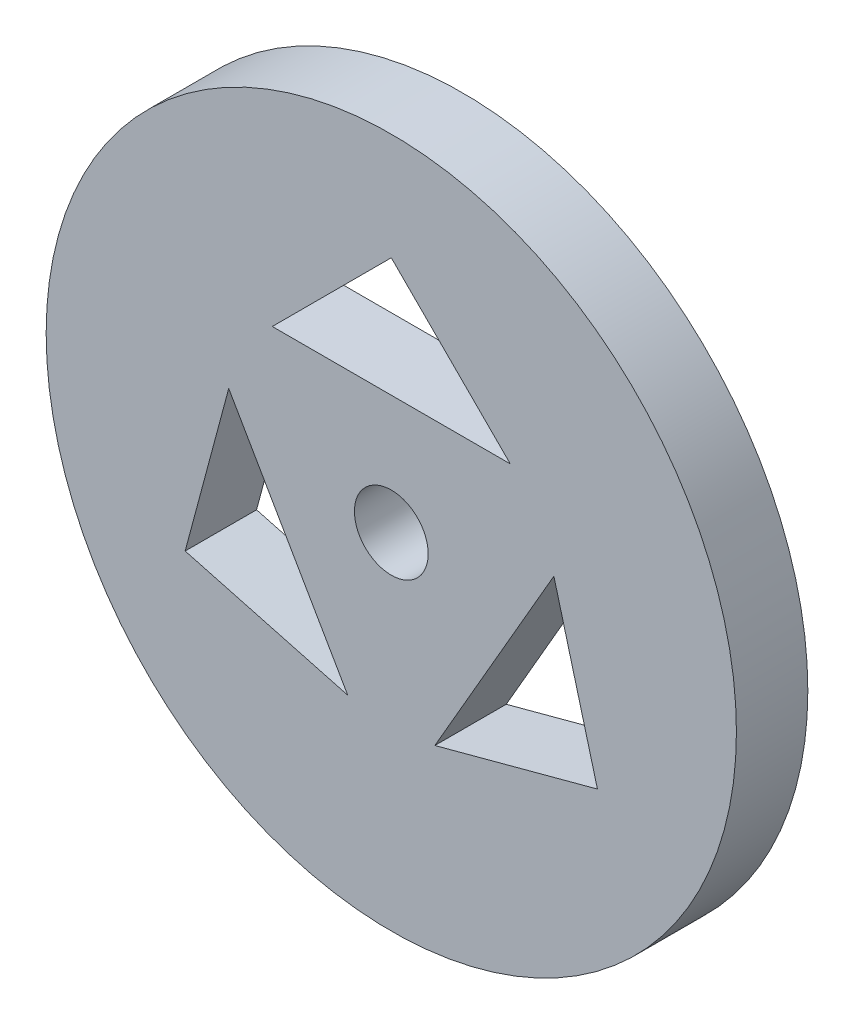
ISO-10303-21;
HEADER;
FILE_DESCRIPTION(('STEP AP214'),'2;1');
FILE_NAME('part.step','',(''),(''),'','','');
FILE_SCHEMA(('AUTOMOTIVE_DESIGN { 1 0 10303 214 1 1 1 1 }'));
ENDSEC;
DATA;
#1=APPLICATION_CONTEXT('core data for automotive mechanical design processes');
#2=APPLICATION_PROTOCOL_DEFINITION('international standard','automotive_design',2000,#1);
#3=PRODUCT_CONTEXT('',#1,'mechanical');
#4=PRODUCT('Part','Part','',(#3));
#5=PRODUCT_RELATED_PRODUCT_CATEGORY('part','',(#4));
#6=PRODUCT_DEFINITION_FORMATION('','',#4);
#7=PRODUCT_DEFINITION_CONTEXT('part definition',#1,'design');
#8=PRODUCT_DEFINITION('design','',#6,#7);
#9=PRODUCT_DEFINITION_SHAPE('','',#8);
#10=(LENGTH_UNIT() NAMED_UNIT(*) SI_UNIT(.MILLI.,.METRE.));
#11=(NAMED_UNIT(*) PLANE_ANGLE_UNIT() SI_UNIT($,.RADIAN.));
#12=(NAMED_UNIT(*) SI_UNIT($,.STERADIAN.) SOLID_ANGLE_UNIT());
#13=UNCERTAINTY_MEASURE_WITH_UNIT(LENGTH_MEASURE(1.E-05),#10,'distance_accuracy_value','');
#14=(GEOMETRIC_REPRESENTATION_CONTEXT(3) GLOBAL_UNCERTAINTY_ASSIGNED_CONTEXT((#13)) GLOBAL_UNIT_ASSIGNED_CONTEXT((#10,
#11,#12)) REPRESENTATION_CONTEXT('',''));
#15=CARTESIAN_POINT('',(0.,0.,0.));
#16=DIRECTION('',(0.,0.,1.));
#17=DIRECTION('',(1.,0.,0.));
#18=AXIS2_PLACEMENT_3D('',#15,#16,#17);
#19=CARTESIAN_POINT('',(0.,0.,6.));
#20=DIRECTION('',(0.,0.,-1.));
#21=DIRECTION('',(-1.,0.,0.));
#22=AXIS2_PLACEMENT_3D('',#19,#20,#21);
#23=CYLINDRICAL_SURFACE('',#22,29.);
#24=CARTESIAN_POINT('',(0.,0.,6.));
#25=DIRECTION('',(0.,0.,1.));
#26=DIRECTION('',(1.,0.,0.));
#27=AXIS2_PLACEMENT_3D('',#24,#25,#26);
#28=CIRCLE('',#27,29.);
#29=CARTESIAN_POINT('',(29.,0.,6.));
#30=VERTEX_POINT('',#29);
#31=EDGE_CURVE('E11',#30,#30,#28,.T.);
#32=ORIENTED_EDGE('',*,*,#31,.F.);
#33=EDGE_LOOP('',(#32));
#34=FACE_BOUND('',#33,.T.);
#35=CARTESIAN_POINT('',(0.,0.,0.));
#36=DIRECTION('',(0.,0.,1.));
#37=DIRECTION('',(1.,0.,0.));
#38=AXIS2_PLACEMENT_3D('',#35,#36,#37);
#39=CIRCLE('',#38,29.);
#40=CARTESIAN_POINT('',(29.,0.,0.));
#41=VERTEX_POINT('',#40);
#42=EDGE_CURVE('E40',#41,#41,#39,.T.);
#43=ORIENTED_EDGE('',*,*,#42,.T.);
#44=EDGE_LOOP('',(#43));
#45=FACE_BOUND('',#44,.T.);
#46=ADVANCED_FACE('F37',(#34,#45),#23,.T.);
#47=CARTESIAN_POINT('',(0.,0.,6.));
#48=DIRECTION('',(0.,0.,1.));
#49=DIRECTION('',(1.,0.,0.));
#50=AXIS2_PLACEMENT_3D('',#47,#48,#49);
#51=PLANE('',#50);
#52=DIRECTION('',(-0.707106781186548,0.707106781186547,0.));
#53=VECTOR('',#52,1.);
#54=CARTESIAN_POINT('',(0.,20.,6.));
#55=LINE('',#54,#53);
#56=CARTESIAN_POINT('',(10.,10.,6.));
#57=VERTEX_POINT('',#56);
#58=CARTESIAN_POINT('',(0.,20.,6.));
#59=VERTEX_POINT('',#58);
#60=EDGE_CURVE('E51',#57,#59,#55,.T.);
#61=ORIENTED_EDGE('',*,*,#60,.F.);
#62=DIRECTION('',(1.,0.,0.));
#63=VECTOR('',#62,1.);
#64=CARTESIAN_POINT('',(-10.,10.,6.));
#65=LINE('',#64,#63);
#66=CARTESIAN_POINT('',(-10.,10.,6.));
#67=VERTEX_POINT('',#66);
#68=EDGE_CURVE('E125',#67,#57,#65,.T.);
#69=ORIENTED_EDGE('',*,*,#68,.F.);
#70=DIRECTION('',(-0.707106781186548,-0.707106781186548,0.));
#71=VECTOR('',#70,1.);
#72=CARTESIAN_POINT('',(-10.,10.,6.));
#73=LINE('',#72,#71);
#74=EDGE_CURVE('E128',#59,#67,#73,.T.);
#75=ORIENTED_EDGE('',*,*,#74,.F.);
#76=EDGE_LOOP('',(#61,#69,#75));
#77=FACE_BOUND('',#76,.T.);
#78=DIRECTION('',(0.965925826289068,0.258819045102521,0.));
#79=VECTOR('',#78,1.);
#80=CARTESIAN_POINT('',(17.320508075689,-9.99999999999932,6.));
#81=LINE('',#80,#79);
#82=CARTESIAN_POINT('',(3.66025403784457,-13.6602540378437,6.));
#83=VERTEX_POINT('',#82);
#84=CARTESIAN_POINT('',(17.320508075689,-9.99999999999932,6.));
#85=VERTEX_POINT('',#84);
#86=EDGE_CURVE('E59',#83,#85,#81,.T.);
#87=ORIENTED_EDGE('',*,*,#86,.F.);
#88=DIRECTION('',(-0.5,-0.866025403784439,0.));
#89=VECTOR('',#88,1.);
#90=CARTESIAN_POINT('',(13.6602540378446,3.66025403784506,6.));
#91=LINE('',#90,#89);
#92=CARTESIAN_POINT('',(13.6602540378446,3.66025403784506,6.));
#93=VERTEX_POINT('',#92);
#94=EDGE_CURVE('E143',#93,#83,#91,.T.);
#95=ORIENTED_EDGE('',*,*,#94,.F.);
#96=DIRECTION('',(-0.258819045102521,0.965925826289068,0.));
#97=VECTOR('',#96,1.);
#98=CARTESIAN_POINT('',(13.6602540378446,3.66025403784506,6.));
#99=LINE('',#98,#97);
#100=EDGE_CURVE('E151',#85,#93,#99,.T.);
#101=ORIENTED_EDGE('',*,*,#100,.F.);
#102=EDGE_LOOP('',(#87,#95,#101));
#103=FACE_BOUND('',#102,.T.);
#104=DIRECTION('',(-0.25881904510252,-0.965925826289068,0.));
#105=VECTOR('',#104,1.);
#106=CARTESIAN_POINT('',(-17.3205080756881,-9.99999999999983,6.));
#107=LINE('',#106,#105);
#108=CARTESIAN_POINT('',(-13.6602540378437,3.66025403784456,6.));
#109=VERTEX_POINT('',#108);
#110=CARTESIAN_POINT('',(-17.3205080756881,-9.99999999999983,6.));
#111=VERTEX_POINT('',#110);
#112=EDGE_CURVE('E172',#109,#111,#107,.T.);
#113=ORIENTED_EDGE('',*,*,#112,.F.);
#114=DIRECTION('',(-0.5,0.866025403784438,0.));
#115=VECTOR('',#114,1.);
#116=CARTESIAN_POINT('',(-3.66025403784371,-13.6602540378442,6.));
#117=LINE('',#116,#115);
#118=CARTESIAN_POINT('',(-3.66025403784371,-13.6602540378442,6.));
#119=VERTEX_POINT('',#118);
#120=EDGE_CURVE('E165',#119,#109,#117,.T.);
#121=ORIENTED_EDGE('',*,*,#120,.F.);
#122=DIRECTION('',(0.965925826289068,-0.25881904510252,0.));
#123=VECTOR('',#122,1.);
#124=CARTESIAN_POINT('',(-3.66025403784371,-13.6602540378442,6.));
#125=LINE('',#124,#123);
#126=EDGE_CURVE('E174',#111,#119,#125,.T.);
#127=ORIENTED_EDGE('',*,*,#126,.F.);
#128=EDGE_LOOP('',(#113,#121,#127));
#129=FACE_BOUND('',#128,.T.);
#130=CARTESIAN_POINT('',(0.,0.,6.));
#131=DIRECTION('',(0.,0.,1.));
#132=DIRECTION('',(1.,0.,0.));
#133=AXIS2_PLACEMENT_3D('',#130,#131,#132);
#134=CIRCLE('',#133,3.1);
#135=CARTESIAN_POINT('',(3.1,0.,6.));
#136=VERTEX_POINT('',#135);
#137=EDGE_CURVE('E137',#136,#136,#134,.T.);
#138=ORIENTED_EDGE('',*,*,#137,.F.);
#139=EDGE_LOOP('',(#138));
#140=FACE_BOUND('',#139,.T.);
#141=ORIENTED_EDGE('',*,*,#31,.T.);
#142=EDGE_LOOP('',(#141));
#143=FACE_BOUND('',#142,.T.);
#144=ADVANCED_FACE('F192',(#77,#103,#129,#140,#143),#51,.T.);
#145=CARTESIAN_POINT('',(0.,0.,0.));
#146=DIRECTION('',(0.,0.,1.));
#147=DIRECTION('',(1.,0.,0.));
#148=AXIS2_PLACEMENT_3D('',#145,#146,#147);
#149=PLANE('',#148);
#150=DIRECTION('',(1.,0.,0.));
#151=VECTOR('',#150,1.);
#152=CARTESIAN_POINT('',(-10.,10.,0.));
#153=LINE('',#152,#151);
#154=CARTESIAN_POINT('',(-10.,10.,0.));
#155=VERTEX_POINT('',#154);
#156=CARTESIAN_POINT('',(10.,10.,0.));
#157=VERTEX_POINT('',#156);
#158=EDGE_CURVE('E115',#155,#157,#153,.T.);
#159=ORIENTED_EDGE('',*,*,#158,.T.);
#160=DIRECTION('',(-0.707106781186548,0.707106781186547,0.));
#161=VECTOR('',#160,1.);
#162=CARTESIAN_POINT('',(0.,20.,0.));
#163=LINE('',#162,#161);
#164=CARTESIAN_POINT('',(0.,20.,0.));
#165=VERTEX_POINT('',#164);
#166=EDGE_CURVE('E109',#157,#165,#163,.T.);
#167=ORIENTED_EDGE('',*,*,#166,.T.);
#168=DIRECTION('',(-0.707106781186548,-0.707106781186548,0.));
#169=VECTOR('',#168,1.);
#170=CARTESIAN_POINT('',(-10.,10.,0.));
#171=LINE('',#170,#169);
#172=EDGE_CURVE('E119',#165,#155,#171,.T.);
#173=ORIENTED_EDGE('',*,*,#172,.T.);
#174=EDGE_LOOP('',(#159,#167,#173));
#175=FACE_BOUND('',#174,.T.);
#176=DIRECTION('',(-0.5,-0.866025403784439,0.));
#177=VECTOR('',#176,1.);
#178=CARTESIAN_POINT('',(13.6602540378446,3.66025403784506,0.));
#179=LINE('',#178,#177);
#180=CARTESIAN_POINT('',(13.6602540378446,3.66025403784506,0.));
#181=VERTEX_POINT('',#180);
#182=CARTESIAN_POINT('',(3.66025403784457,-13.6602540378437,0.));
#183=VERTEX_POINT('',#182);
#184=EDGE_CURVE('E146',#181,#183,#179,.T.);
#185=ORIENTED_EDGE('',*,*,#184,.T.);
#186=DIRECTION('',(0.965925826289068,0.258819045102521,0.));
#187=VECTOR('',#186,1.);
#188=CARTESIAN_POINT('',(17.320508075689,-9.99999999999932,0.));
#189=LINE('',#188,#187);
#190=CARTESIAN_POINT('',(17.320508075689,-9.99999999999932,0.));
#191=VERTEX_POINT('',#190);
#192=EDGE_CURVE('E139',#183,#191,#189,.T.);
#193=ORIENTED_EDGE('',*,*,#192,.T.);
#194=DIRECTION('',(-0.258819045102521,0.965925826289068,0.));
#195=VECTOR('',#194,1.);
#196=CARTESIAN_POINT('',(13.6602540378446,3.66025403784506,0.));
#197=LINE('',#196,#195);
#198=EDGE_CURVE('E142',#191,#181,#197,.T.);
#199=ORIENTED_EDGE('',*,*,#198,.T.);
#200=EDGE_LOOP('',(#185,#193,#199));
#201=FACE_BOUND('',#200,.T.);
#202=DIRECTION('',(-0.5,0.866025403784438,0.));
#203=VECTOR('',#202,1.);
#204=CARTESIAN_POINT('',(-3.66025403784371,-13.6602540378442,0.));
#205=LINE('',#204,#203);
#206=CARTESIAN_POINT('',(-3.66025403784371,-13.6602540378442,0.));
#207=VERTEX_POINT('',#206);
#208=CARTESIAN_POINT('',(-13.6602540378437,3.66025403784456,0.));
#209=VERTEX_POINT('',#208);
#210=EDGE_CURVE('E168',#207,#209,#205,.T.);
#211=ORIENTED_EDGE('',*,*,#210,.T.);
#212=DIRECTION('',(-0.25881904510252,-0.965925826289068,0.));
#213=VECTOR('',#212,1.);
#214=CARTESIAN_POINT('',(-17.3205080756881,-9.99999999999983,0.));
#215=LINE('',#214,#213);
#216=CARTESIAN_POINT('',(-17.3205080756881,-9.99999999999983,0.));
#217=VERTEX_POINT('',#216);
#218=EDGE_CURVE('E161',#209,#217,#215,.T.);
#219=ORIENTED_EDGE('',*,*,#218,.T.);
#220=DIRECTION('',(0.965925826289068,-0.25881904510252,0.));
#221=VECTOR('',#220,1.);
#222=CARTESIAN_POINT('',(-3.66025403784371,-13.6602540378442,0.));
#223=LINE('',#222,#221);
#224=EDGE_CURVE('E164',#217,#207,#223,.T.);
#225=ORIENTED_EDGE('',*,*,#224,.T.);
#226=EDGE_LOOP('',(#211,#219,#225));
#227=FACE_BOUND('',#226,.T.);
#228=CARTESIAN_POINT('',(0.,0.,0.));
#229=DIRECTION('',(0.,0.,1.));
#230=DIRECTION('',(1.,0.,0.));
#231=AXIS2_PLACEMENT_3D('',#228,#229,#230);
#232=CIRCLE('',#231,3.1);
#233=CARTESIAN_POINT('',(3.1,0.,0.));
#234=VERTEX_POINT('',#233);
#235=EDGE_CURVE('E184',#234,#234,#232,.T.);
#236=ORIENTED_EDGE('',*,*,#235,.T.);
#237=EDGE_LOOP('',(#236));
#238=FACE_BOUND('',#237,.T.);
#239=ORIENTED_EDGE('',*,*,#42,.F.);
#240=EDGE_LOOP('',(#239));
#241=FACE_BOUND('',#240,.T.);
#242=ADVANCED_FACE('F123',(#175,#201,#227,#238,#241),#149,.F.);
#243=CARTESIAN_POINT('',(0.,0.,0.));
#244=DIRECTION('',(0.,0.,1.));
#245=DIRECTION('',(1.,0.,0.));
#246=AXIS2_PLACEMENT_3D('',#243,#244,#245);
#247=CYLINDRICAL_SURFACE('',#246,3.1);
#248=ORIENTED_EDGE('',*,*,#235,.F.);
#249=EDGE_LOOP('',(#248));
#250=FACE_BOUND('',#249,.T.);
#251=ORIENTED_EDGE('',*,*,#137,.T.);
#252=EDGE_LOOP('',(#251));
#253=FACE_BOUND('',#252,.T.);
#254=ADVANCED_FACE('F190',(#250,#253),#247,.F.);
#255=CARTESIAN_POINT('',(-17.3205080756881,-9.99999999999983,0.));
#256=DIRECTION('',(-0.965925826289069,0.25881904510252,0.));
#257=DIRECTION('',(-0.25881904510252,-0.965925826289069,0.));
#258=AXIS2_PLACEMENT_3D('',#255,#256,#257);
#259=PLANE('',#258);
#260=ORIENTED_EDGE('',*,*,#112,.T.);
#261=DIRECTION('',(0.,0.,1.));
#262=VECTOR('',#261,1.);
#263=CARTESIAN_POINT('',(-17.3205080756881,-9.99999999999983,0.));
#264=LINE('',#263,#262);
#265=EDGE_CURVE('E171',#217,#111,#264,.T.);
#266=ORIENTED_EDGE('',*,*,#265,.F.);
#267=ORIENTED_EDGE('',*,*,#218,.F.);
#268=DIRECTION('',(0.,0.,1.));
#269=VECTOR('',#268,1.);
#270=CARTESIAN_POINT('',(-13.6602540378437,3.66025403784456,0.));
#271=LINE('',#270,#269);
#272=EDGE_CURVE('E152',#209,#109,#271,.T.);
#273=ORIENTED_EDGE('',*,*,#272,.T.);
#274=EDGE_LOOP('',(#260,#266,#267,#273));
#275=FACE_BOUND('',#274,.T.);
#276=ADVANCED_FACE('F208',(#275),#259,.F.);
#277=CARTESIAN_POINT('',(-3.66025403784371,-13.6602540378442,0.));
#278=DIRECTION('',(0.866025403784438,0.5,0.));
#279=DIRECTION('',(-0.5,0.866025403784438,0.));
#280=AXIS2_PLACEMENT_3D('',#277,#278,#279);
#281=PLANE('',#280);
#282=ORIENTED_EDGE('',*,*,#120,.T.);
#283=ORIENTED_EDGE('',*,*,#272,.F.);
#284=ORIENTED_EDGE('',*,*,#210,.F.);
#285=DIRECTION('',(0.,0.,1.));
#286=VECTOR('',#285,1.);
#287=CARTESIAN_POINT('',(-3.66025403784371,-13.6602540378442,0.));
#288=LINE('',#287,#286);
#289=EDGE_CURVE('E180',#207,#119,#288,.T.);
#290=ORIENTED_EDGE('',*,*,#289,.T.);
#291=EDGE_LOOP('',(#282,#283,#284,#290));
#292=FACE_BOUND('',#291,.T.);
#293=ADVANCED_FACE('F214',(#292),#281,.F.);
#294=CARTESIAN_POINT('',(-3.66025403784371,-13.6602540378442,0.));
#295=DIRECTION('',(-0.25881904510252,-0.965925826289068,0.));
#296=DIRECTION('',(0.965925826289069,-0.25881904510252,0.));
#297=AXIS2_PLACEMENT_3D('',#294,#295,#296);
#298=PLANE('',#297);
#299=ORIENTED_EDGE('',*,*,#126,.T.);
#300=ORIENTED_EDGE('',*,*,#289,.F.);
#301=ORIENTED_EDGE('',*,*,#224,.F.);
#302=ORIENTED_EDGE('',*,*,#265,.T.);
#303=EDGE_LOOP('',(#299,#300,#301,#302));
#304=FACE_BOUND('',#303,.T.);
#305=ADVANCED_FACE('F216',(#304),#298,.F.);
#306=CARTESIAN_POINT('',(17.320508075689,-9.99999999999932,0.));
#307=DIRECTION('',(0.258819045102521,-0.965925826289068,0.));
#308=DIRECTION('',(0.965925826289068,0.258819045102521,0.));
#309=AXIS2_PLACEMENT_3D('',#306,#307,#308);
#310=PLANE('',#309);
#311=ORIENTED_EDGE('',*,*,#86,.T.);
#312=DIRECTION('',(0.,0.,1.));
#313=VECTOR('',#312,1.);
#314=CARTESIAN_POINT('',(17.320508075689,-9.99999999999932,0.));
#315=LINE('',#314,#313);
#316=EDGE_CURVE('E149',#191,#85,#315,.T.);
#317=ORIENTED_EDGE('',*,*,#316,.F.);
#318=ORIENTED_EDGE('',*,*,#192,.F.);
#319=DIRECTION('',(0.,0.,1.));
#320=VECTOR('',#319,1.);
#321=CARTESIAN_POINT('',(3.66025403784457,-13.6602540378437,0.));
#322=LINE('',#321,#320);
#323=EDGE_CURVE('E133',#183,#83,#322,.T.);
#324=ORIENTED_EDGE('',*,*,#323,.T.);
#325=EDGE_LOOP('',(#311,#317,#318,#324));
#326=FACE_BOUND('',#325,.T.);
#327=ADVANCED_FACE('F219',(#326),#310,.F.);
#328=CARTESIAN_POINT('',(13.6602540378446,3.66025403784506,0.));
#329=DIRECTION('',(-0.866025403784439,0.5,0.));
#330=DIRECTION('',(-0.5,-0.866025403784439,0.));
#331=AXIS2_PLACEMENT_3D('',#328,#329,#330);
#332=PLANE('',#331);
#333=ORIENTED_EDGE('',*,*,#94,.T.);
#334=ORIENTED_EDGE('',*,*,#323,.F.);
#335=ORIENTED_EDGE('',*,*,#184,.F.);
#336=DIRECTION('',(0.,0.,1.));
#337=VECTOR('',#336,1.);
#338=CARTESIAN_POINT('',(13.6602540378446,3.66025403784506,0.));
#339=LINE('',#338,#337);
#340=EDGE_CURVE('E158',#181,#93,#339,.T.);
#341=ORIENTED_EDGE('',*,*,#340,.T.);
#342=EDGE_LOOP('',(#333,#334,#335,#341));
#343=FACE_BOUND('',#342,.T.);
#344=ADVANCED_FACE('F226',(#343),#332,.F.);
#345=CARTESIAN_POINT('',(13.6602540378446,3.66025403784506,0.));
#346=DIRECTION('',(0.965925826289068,0.258819045102521,0.));
#347=DIRECTION('',(-0.258819045102521,0.965925826289068,0.));
#348=AXIS2_PLACEMENT_3D('',#345,#346,#347);
#349=PLANE('',#348);
#350=ORIENTED_EDGE('',*,*,#100,.T.);
#351=ORIENTED_EDGE('',*,*,#340,.F.);
#352=ORIENTED_EDGE('',*,*,#198,.F.);
#353=ORIENTED_EDGE('',*,*,#316,.T.);
#354=EDGE_LOOP('',(#350,#351,#352,#353));
#355=FACE_BOUND('',#354,.T.);
#356=ADVANCED_FACE('F227',(#355),#349,.F.);
#357=CARTESIAN_POINT('',(0.,20.,0.));
#358=DIRECTION('',(0.707106781186547,0.707106781186548,0.));
#359=DIRECTION('',(-0.707106781186548,0.707106781186547,0.));
#360=AXIS2_PLACEMENT_3D('',#357,#358,#359);
#361=PLANE('',#360);
#362=ORIENTED_EDGE('',*,*,#60,.T.);
#363=DIRECTION('',(0.,0.,1.));
#364=VECTOR('',#363,1.);
#365=CARTESIAN_POINT('',(0.,20.,0.));
#366=LINE('',#365,#364);
#367=EDGE_CURVE('E105',#165,#59,#366,.T.);
#368=ORIENTED_EDGE('',*,*,#367,.F.);
#369=ORIENTED_EDGE('',*,*,#166,.F.);
#370=DIRECTION('',(0.,0.,1.));
#371=VECTOR('',#370,1.);
#372=CARTESIAN_POINT('',(10.,10.,0.));
#373=LINE('',#372,#371);
#374=EDGE_CURVE('E135',#157,#57,#373,.T.);
#375=ORIENTED_EDGE('',*,*,#374,.T.);
#376=EDGE_LOOP('',(#362,#368,#369,#375));
#377=FACE_BOUND('',#376,.T.);
#378=ADVANCED_FACE('F107',(#377),#361,.F.);
#379=CARTESIAN_POINT('',(-10.,10.,0.));
#380=DIRECTION('',(0.,-1.,0.));
#381=DIRECTION('',(0.,0.,-1.));
#382=AXIS2_PLACEMENT_3D('',#379,#380,#381);
#383=PLANE('',#382);
#384=ORIENTED_EDGE('',*,*,#68,.T.);
#385=ORIENTED_EDGE('',*,*,#374,.F.);
#386=ORIENTED_EDGE('',*,*,#158,.F.);
#387=DIRECTION('',(0.,0.,1.));
#388=VECTOR('',#387,1.);
#389=CARTESIAN_POINT('',(-10.,10.,0.));
#390=LINE('',#389,#388);
#391=EDGE_CURVE('E114',#155,#67,#390,.T.);
#392=ORIENTED_EDGE('',*,*,#391,.T.);
#393=EDGE_LOOP('',(#384,#385,#386,#392));
#394=FACE_BOUND('',#393,.T.);
#395=ADVANCED_FACE('F236',(#394),#383,.F.);
#396=CARTESIAN_POINT('',(-10.,10.,0.));
#397=DIRECTION('',(-0.707106781186547,0.707106781186547,0.));
#398=DIRECTION('',(-0.707106781186548,-0.707106781186548,0.));
#399=AXIS2_PLACEMENT_3D('',#396,#397,#398);
#400=PLANE('',#399);
#401=ORIENTED_EDGE('',*,*,#74,.T.);
#402=ORIENTED_EDGE('',*,*,#391,.F.);
#403=ORIENTED_EDGE('',*,*,#172,.F.);
#404=ORIENTED_EDGE('',*,*,#367,.T.);
#405=EDGE_LOOP('',(#401,#402,#403,#404));
#406=FACE_BOUND('',#405,.T.);
#407=ADVANCED_FACE('F120',(#406),#400,.F.);
#408=CLOSED_SHELL('',(#46,#144,#242,#254,#276,#293,#305,#327,#344,#356,#378,#395,#407));
#409=MANIFOLD_SOLID_BREP('B2',#408);
#410=ADVANCED_BREP_SHAPE_REPRESENTATION('',(#18,#409),#14);
#411=SHAPE_DEFINITION_REPRESENTATION(#9,#410);
ENDSEC;
END-ISO-10303-21;
